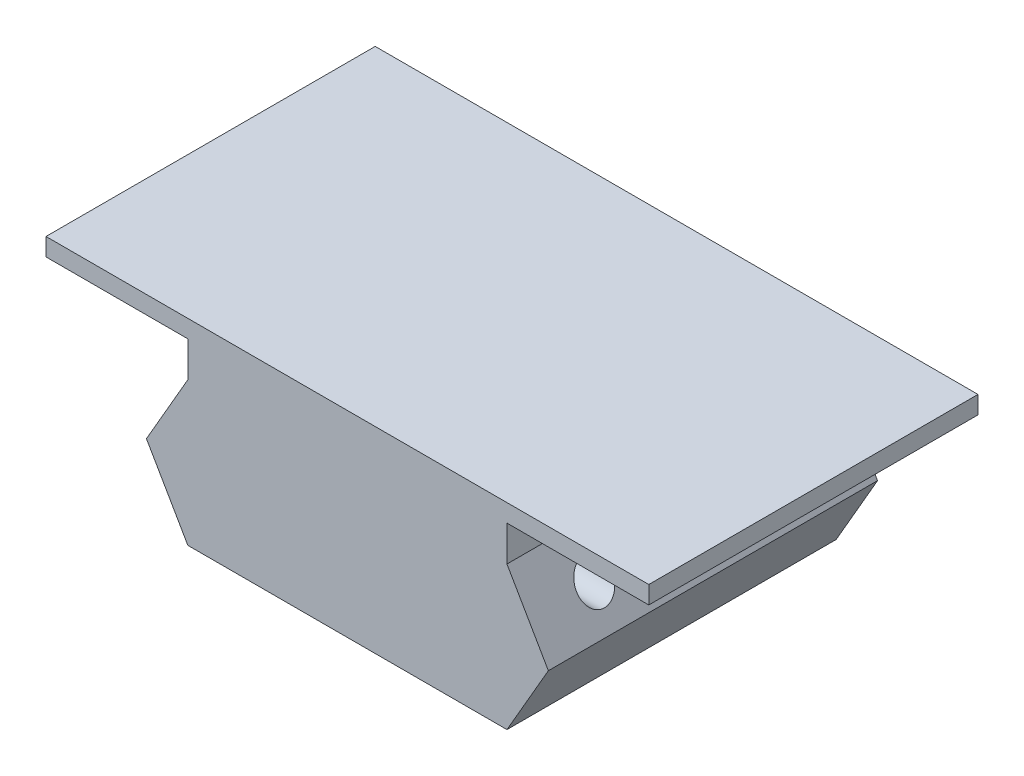
ISO-10303-21;
HEADER;
FILE_DESCRIPTION(('STEP AP214'),'2;1');
FILE_NAME('part.step','',(''),(''),'','','');
FILE_SCHEMA(('AUTOMOTIVE_DESIGN { 1 0 10303 214 1 1 1 1 }'));
ENDSEC;
DATA;
#1=APPLICATION_CONTEXT('core data for automotive mechanical design processes');
#2=APPLICATION_PROTOCOL_DEFINITION('international standard','automotive_design',2000,#1);
#3=PRODUCT_CONTEXT('',#1,'mechanical');
#4=PRODUCT('Part','Part','',(#3));
#5=PRODUCT_RELATED_PRODUCT_CATEGORY('part','',(#4));
#6=PRODUCT_DEFINITION_FORMATION('','',#4);
#7=PRODUCT_DEFINITION_CONTEXT('part definition',#1,'design');
#8=PRODUCT_DEFINITION('design','',#6,#7);
#9=PRODUCT_DEFINITION_SHAPE('','',#8);
#10=(LENGTH_UNIT() NAMED_UNIT(*) SI_UNIT(.MILLI.,.METRE.));
#11=(NAMED_UNIT(*) PLANE_ANGLE_UNIT() SI_UNIT($,.RADIAN.));
#12=(NAMED_UNIT(*) SI_UNIT($,.STERADIAN.) SOLID_ANGLE_UNIT());
#13=UNCERTAINTY_MEASURE_WITH_UNIT(LENGTH_MEASURE(1.E-05),#10,'distance_accuracy_value','');
#14=(GEOMETRIC_REPRESENTATION_CONTEXT(3) GLOBAL_UNCERTAINTY_ASSIGNED_CONTEXT((#13)) GLOBAL_UNIT_ASSIGNED_CONTEXT((#10,
#11,#12)) REPRESENTATION_CONTEXT('',''));
#15=CARTESIAN_POINT('',(0.,0.,0.));
#16=DIRECTION('',(0.,0.,1.));
#17=DIRECTION('',(1.,0.,0.));
#18=AXIS2_PLACEMENT_3D('',#15,#16,#17);
#19=CARTESIAN_POINT('',(-16.3069995829945,10.0886772713467,-18.568445));
#20=DIRECTION('',(1.,0.,0.));
#21=DIRECTION('',(0.,0.,-1.));
#22=AXIS2_PLACEMENT_3D('',#19,#20,#21);
#23=PLANE('',#22);
#24=DIRECTION('',(0.,1.,0.));
#25=VECTOR('',#24,1.);
#26=CARTESIAN_POINT('',(-16.3069995829945,10.0886772713467,0.));
#27=LINE('',#26,#25);
#28=CARTESIAN_POINT('',(-16.3069995829945,10.0886772713467,0.));
#29=VERTEX_POINT('',#28);
#30=CARTESIAN_POINT('',(-16.3069995829945,11.0886772713467,0.));
#31=VERTEX_POINT('',#30);
#32=EDGE_CURVE('E172',#29,#31,#27,.T.);
#33=ORIENTED_EDGE('',*,*,#32,.T.);
#34=DIRECTION('',(0.,0.,1.));
#35=VECTOR('',#34,1.);
#36=CARTESIAN_POINT('',(-16.3069995829945,11.0886772713467,-18.568445));
#37=LINE('',#36,#35);
#38=CARTESIAN_POINT('',(-16.3069995829945,11.0886772713467,-18.568445));
#39=VERTEX_POINT('',#38);
#40=EDGE_CURVE('E11',#39,#31,#37,.T.);
#41=ORIENTED_EDGE('',*,*,#40,.F.);
#42=DIRECTION('',(0.,1.,0.));
#43=VECTOR('',#42,1.);
#44=CARTESIAN_POINT('',(-16.3069995829945,10.0886772713467,-18.568445));
#45=LINE('',#44,#43);
#46=CARTESIAN_POINT('',(-16.3069995829945,10.0886772713467,-18.568445));
#47=VERTEX_POINT('',#46);
#48=EDGE_CURVE('E207',#47,#39,#45,.T.);
#49=ORIENTED_EDGE('',*,*,#48,.F.);
#50=DIRECTION('',(0.,0.,1.));
#51=VECTOR('',#50,1.);
#52=CARTESIAN_POINT('',(-16.3069995829945,10.0886772713467,-18.568445));
#53=LINE('',#52,#51);
#54=EDGE_CURVE('E168',#47,#29,#53,.T.);
#55=ORIENTED_EDGE('',*,*,#54,.T.);
#56=EDGE_LOOP('',(#33,#41,#49,#55));
#57=FACE_BOUND('',#56,.T.);
#58=ADVANCED_FACE('F45',(#57),#23,.F.);
#59=CARTESIAN_POINT('',(-16.3069995829945,11.0886772713467,-18.568445));
#60=DIRECTION('',(0.,-1.,0.));
#61=DIRECTION('',(0.,0.,-1.));
#62=AXIS2_PLACEMENT_3D('',#59,#60,#61);
#63=PLANE('',#62);
#64=DIRECTION('',(1.,0.,0.));
#65=VECTOR('',#64,1.);
#66=CARTESIAN_POINT('',(-16.3069995829945,11.0886772713467,0.));
#67=LINE('',#66,#65);
#68=CARTESIAN_POINT('',(17.6930004170055,11.0886772713467,0.));
#69=VERTEX_POINT('',#68);
#70=EDGE_CURVE('E176',#31,#69,#67,.T.);
#71=ORIENTED_EDGE('',*,*,#70,.T.);
#72=DIRECTION('',(0.,0.,1.));
#73=VECTOR('',#72,1.);
#74=CARTESIAN_POINT('',(17.6930004170055,11.0886772713467,-18.568445));
#75=LINE('',#74,#73);
#76=CARTESIAN_POINT('',(17.6930004170055,11.0886772713467,-18.568445));
#77=VERTEX_POINT('',#76);
#78=EDGE_CURVE('E55',#77,#69,#75,.T.);
#79=ORIENTED_EDGE('',*,*,#78,.F.);
#80=DIRECTION('',(1.,0.,0.));
#81=VECTOR('',#80,1.);
#82=CARTESIAN_POINT('',(-16.3069995829945,11.0886772713467,-18.568445));
#83=LINE('',#82,#81);
#84=EDGE_CURVE('E119',#39,#77,#83,.T.);
#85=ORIENTED_EDGE('',*,*,#84,.F.);
#86=ORIENTED_EDGE('',*,*,#40,.T.);
#87=EDGE_LOOP('',(#71,#79,#85,#86));
#88=FACE_BOUND('',#87,.T.);
#89=ADVANCED_FACE('F349',(#88),#63,.F.);
#90=CARTESIAN_POINT('',(17.6930004170055,11.0886772713467,-18.568445));
#91=DIRECTION('',(-1.,0.,0.));
#92=DIRECTION('',(0.,0.,1.));
#93=AXIS2_PLACEMENT_3D('',#90,#91,#92);
#94=PLANE('',#93);
#95=DIRECTION('',(0.,-1.,0.));
#96=VECTOR('',#95,1.);
#97=CARTESIAN_POINT('',(17.6930004170055,11.0886772713467,0.));
#98=LINE('',#97,#96);
#99=CARTESIAN_POINT('',(17.6930004170055,10.0886772713467,0.));
#100=VERTEX_POINT('',#99);
#101=EDGE_CURVE('E180',#69,#100,#98,.T.);
#102=ORIENTED_EDGE('',*,*,#101,.T.);
#103=DIRECTION('',(0.,0.,1.));
#104=VECTOR('',#103,1.);
#105=CARTESIAN_POINT('',(17.6930004170055,10.0886772713467,-18.568445));
#106=LINE('',#105,#104);
#107=CARTESIAN_POINT('',(17.6930004170055,10.0886772713467,-18.568445));
#108=VERTEX_POINT('',#107);
#109=EDGE_CURVE('E234',#108,#100,#106,.T.);
#110=ORIENTED_EDGE('',*,*,#109,.F.);
#111=DIRECTION('',(0.,-1.,0.));
#112=VECTOR('',#111,1.);
#113=CARTESIAN_POINT('',(17.6930004170055,11.0886772713467,-18.568445));
#114=LINE('',#113,#112);
#115=EDGE_CURVE('E273',#77,#108,#114,.T.);
#116=ORIENTED_EDGE('',*,*,#115,.F.);
#117=ORIENTED_EDGE('',*,*,#78,.T.);
#118=EDGE_LOOP('',(#102,#110,#116,#117));
#119=FACE_BOUND('',#118,.T.);
#120=ADVANCED_FACE('F353',(#119),#94,.F.);
#121=CARTESIAN_POINT('',(17.6930004170055,10.0886772713467,-18.568445));
#122=DIRECTION('',(0.,1.,0.));
#123=DIRECTION('',(0.,0.,1.));
#124=AXIS2_PLACEMENT_3D('',#121,#122,#123);
#125=PLANE('',#124);
#126=DIRECTION('',(-1.,0.,0.));
#127=VECTOR('',#126,1.);
#128=CARTESIAN_POINT('',(17.6930004170055,10.0886772713467,0.));
#129=LINE('',#128,#127);
#130=CARTESIAN_POINT('',(9.69300041700538,10.0886772713467,0.));
#131=VERTEX_POINT('',#130);
#132=EDGE_CURVE('E183',#100,#131,#129,.T.);
#133=ORIENTED_EDGE('',*,*,#132,.T.);
#134=DIRECTION('',(0.,0.,1.));
#135=VECTOR('',#134,1.);
#136=CARTESIAN_POINT('',(9.69300041700538,10.0886772713467,-18.568445));
#137=LINE('',#136,#135);
#138=CARTESIAN_POINT('',(9.69300041700538,10.0886772713467,-18.568445));
#139=VERTEX_POINT('',#138);
#140=EDGE_CURVE('E230',#139,#131,#137,.T.);
#141=ORIENTED_EDGE('',*,*,#140,.F.);
#142=DIRECTION('',(-1.,0.,0.));
#143=VECTOR('',#142,1.);
#144=CARTESIAN_POINT('',(17.6930004170055,10.0886772713467,-18.568445));
#145=LINE('',#144,#143);
#146=EDGE_CURVE('E276',#108,#139,#145,.T.);
#147=ORIENTED_EDGE('',*,*,#146,.F.);
#148=ORIENTED_EDGE('',*,*,#109,.T.);
#149=EDGE_LOOP('',(#133,#141,#147,#148));
#150=FACE_BOUND('',#149,.T.);
#151=ADVANCED_FACE('F357',(#150),#125,.F.);
#152=CARTESIAN_POINT('',(9.69300041700538,10.0886772713467,-18.568445));
#153=DIRECTION('',(-1.,0.,0.));
#154=DIRECTION('',(0.,-1.,0.));
#155=AXIS2_PLACEMENT_3D('',#152,#153,#154);
#156=PLANE('',#155);
#157=DIRECTION('',(0.,-1.,0.));
#158=VECTOR('',#157,1.);
#159=CARTESIAN_POINT('',(9.69300041700538,10.0886772713467,0.));
#160=LINE('',#159,#158);
#161=CARTESIAN_POINT('',(9.69300041700546,8.08867727134664,0.));
#162=VERTEX_POINT('',#161);
#163=EDGE_CURVE('E186',#131,#162,#160,.T.);
#164=ORIENTED_EDGE('',*,*,#163,.T.);
#165=DIRECTION('',(0.,0.,1.));
#166=VECTOR('',#165,1.);
#167=CARTESIAN_POINT('',(9.69300041700546,8.08867727134664,-18.568445));
#168=LINE('',#167,#166);
#169=CARTESIAN_POINT('',(9.69300041700546,8.08867727134664,-18.568445));
#170=VERTEX_POINT('',#169);
#171=EDGE_CURVE('E226',#170,#162,#168,.T.);
#172=ORIENTED_EDGE('',*,*,#171,.F.);
#173=DIRECTION('',(0.,-1.,0.));
#174=VECTOR('',#173,1.);
#175=CARTESIAN_POINT('',(9.69300041700538,10.0886772713467,-18.568445));
#176=LINE('',#175,#174);
#177=EDGE_CURVE('E279',#139,#170,#176,.T.);
#178=ORIENTED_EDGE('',*,*,#177,.F.);
#179=ORIENTED_EDGE('',*,*,#140,.T.);
#180=EDGE_LOOP('',(#164,#172,#178,#179));
#181=FACE_BOUND('',#180,.T.);
#182=ADVANCED_FACE('F307',(#181),#156,.F.);
#183=CARTESIAN_POINT('',(9.69300041700546,8.08867727134664,-18.568445));
#184=DIRECTION('',(-0.866025403784435,-0.500000000000006,0.));
#185=DIRECTION('',(0.500000000000006,-0.866025403784435,0.));
#186=AXIS2_PLACEMENT_3D('',#183,#184,#185);
#187=PLANE('',#186);
#188=CARTESIAN_POINT('',(10.9054359823037,5.98867727134664,-3.71));
#189=DIRECTION('',(-0.866025403784435,-0.500000000000006,0.));
#190=DIRECTION('',(0.500000000000006,-0.866025403784435,0.));
#191=AXIS2_PLACEMENT_3D('',#188,#189,#190);
#192=ELLIPSE('',#191,1.15470053837926,1.);
#193=CARTESIAN_POINT('',(11.4827862514933,4.98867727134664,-3.71));
#194=VERTEX_POINT('',#193);
#195=EDGE_CURVE('E177',#194,#194,#192,.T.);
#196=ORIENTED_EDGE('',*,*,#195,.T.);
#197=EDGE_LOOP('',(#196));
#198=FACE_BOUND('',#197,.T.);
#199=CARTESIAN_POINT('',(10.9054359823037,5.98867727134664,-7.42));
#200=DIRECTION('',(-0.866025403784435,-0.500000000000006,0.));
#201=DIRECTION('',(0.500000000000006,-0.866025403784435,0.));
#202=AXIS2_PLACEMENT_3D('',#199,#200,#201);
#203=ELLIPSE('',#202,1.15470053837926,1.);
#204=CARTESIAN_POINT('',(11.4827862514933,4.98867727134664,-7.42));
#205=VERTEX_POINT('',#204);
#206=EDGE_CURVE('E253',#205,#205,#203,.T.);
#207=ORIENTED_EDGE('',*,*,#206,.T.);
#208=EDGE_LOOP('',(#207));
#209=FACE_BOUND('',#208,.T.);
#210=CARTESIAN_POINT('',(10.9054359823037,5.98867727134664,-11.13));
#211=DIRECTION('',(-0.866025403784435,-0.500000000000006,0.));
#212=DIRECTION('',(0.500000000000006,-0.866025403784435,0.));
#213=AXIS2_PLACEMENT_3D('',#210,#211,#212);
#214=ELLIPSE('',#213,1.15470053837926,1.);
#215=CARTESIAN_POINT('',(11.4827862514933,4.98867727134664,-11.13));
#216=VERTEX_POINT('',#215);
#217=EDGE_CURVE('E249',#216,#216,#214,.T.);
#218=ORIENTED_EDGE('',*,*,#217,.T.);
#219=EDGE_LOOP('',(#218));
#220=FACE_BOUND('',#219,.T.);
#221=CARTESIAN_POINT('',(10.9054359823037,5.98867727134664,-14.84));
#222=DIRECTION('',(-0.866025403784435,-0.500000000000006,0.));
#223=DIRECTION('',(0.500000000000006,-0.866025403784435,0.));
#224=AXIS2_PLACEMENT_3D('',#221,#222,#223);
#225=ELLIPSE('',#224,1.15470053837926,1.);
#226=CARTESIAN_POINT('',(11.4827862514933,4.98867727134664,-14.84));
#227=VERTEX_POINT('',#226);
#228=EDGE_CURVE('E245',#227,#227,#225,.T.);
#229=ORIENTED_EDGE('',*,*,#228,.T.);
#230=EDGE_LOOP('',(#229));
#231=FACE_BOUND('',#230,.T.);
#232=DIRECTION('',(0.500000000000007,-0.866025403784435,0.));
#233=VECTOR('',#232,1.);
#234=CARTESIAN_POINT('',(9.69300041700546,8.08867727134664,0.));
#235=LINE('',#234,#233);
#236=CARTESIAN_POINT('',(12.0280004170055,4.04433863567331,0.));
#237=VERTEX_POINT('',#236);
#238=EDGE_CURVE('E189',#162,#237,#235,.T.);
#239=ORIENTED_EDGE('',*,*,#238,.T.);
#240=DIRECTION('',(0.,0.,1.));
#241=VECTOR('',#240,1.);
#242=CARTESIAN_POINT('',(12.0280004170055,4.04433863567331,-18.568445));
#243=LINE('',#242,#241);
#244=CARTESIAN_POINT('',(12.0280004170055,4.04433863567331,-18.568445));
#245=VERTEX_POINT('',#244);
#246=EDGE_CURVE('E222',#245,#237,#243,.T.);
#247=ORIENTED_EDGE('',*,*,#246,.F.);
#248=DIRECTION('',(0.500000000000007,-0.866025403784435,0.));
#249=VECTOR('',#248,1.);
#250=CARTESIAN_POINT('',(9.69300041700546,8.08867727134664,-18.568445));
#251=LINE('',#250,#249);
#252=EDGE_CURVE('E282',#170,#245,#251,.T.);
#253=ORIENTED_EDGE('',*,*,#252,.F.);
#254=ORIENTED_EDGE('',*,*,#171,.T.);
#255=EDGE_LOOP('',(#239,#247,#253,#254));
#256=FACE_BOUND('',#255,.T.);
#257=ADVANCED_FACE('F303',(#198,#209,#220,#231,#256),#187,.F.);
#258=CARTESIAN_POINT('',(12.0280004170055,4.04433863567331,-18.568445));
#259=DIRECTION('',(-0.866025403784441,0.499999999999997,0.));
#260=DIRECTION('',(-0.499999999999997,-0.866025403784441,0.));
#261=AXIS2_PLACEMENT_3D('',#258,#259,#260);
#262=PLANE('',#261);
#263=DIRECTION('',(-0.499999999999997,-0.866025403784441,0.));
#264=VECTOR('',#263,1.);
#265=CARTESIAN_POINT('',(12.0280004170055,4.04433863567331,0.));
#266=LINE('',#265,#264);
#267=CARTESIAN_POINT('',(9.69300041700553,0.,0.));
#268=VERTEX_POINT('',#267);
#269=EDGE_CURVE('E192',#237,#268,#266,.T.);
#270=ORIENTED_EDGE('',*,*,#269,.T.);
#271=DIRECTION('',(0.,0.,1.));
#272=VECTOR('',#271,1.);
#273=CARTESIAN_POINT('',(9.69300041700553,0.,-18.568445));
#274=LINE('',#273,#272);
#275=CARTESIAN_POINT('',(9.69300041700553,0.,-18.568445));
#276=VERTEX_POINT('',#275);
#277=EDGE_CURVE('E218',#276,#268,#274,.T.);
#278=ORIENTED_EDGE('',*,*,#277,.F.);
#279=DIRECTION('',(-0.499999999999997,-0.866025403784441,0.));
#280=VECTOR('',#279,1.);
#281=CARTESIAN_POINT('',(12.0280004170055,4.04433863567331,-18.568445));
#282=LINE('',#281,#280);
#283=EDGE_CURVE('E285',#245,#276,#282,.T.);
#284=ORIENTED_EDGE('',*,*,#283,.F.);
#285=ORIENTED_EDGE('',*,*,#246,.T.);
#286=EDGE_LOOP('',(#270,#278,#284,#285));
#287=FACE_BOUND('',#286,.T.);
#288=ADVANCED_FACE('F306',(#287),#262,.F.);
#289=CARTESIAN_POINT('',(9.69300041700553,0.,-18.568445));
#290=DIRECTION('',(0.,1.,0.));
#291=DIRECTION('',(-1.,0.,0.));
#292=AXIS2_PLACEMENT_3D('',#289,#290,#291);
#293=PLANE('',#292);
#294=DIRECTION('',(-1.,0.,0.));
#295=VECTOR('',#294,1.);
#296=CARTESIAN_POINT('',(9.69300041700553,0.,0.));
#297=LINE('',#296,#295);
#298=CARTESIAN_POINT('',(-8.30699958299447,0.,0.));
#299=VERTEX_POINT('',#298);
#300=EDGE_CURVE('E195',#268,#299,#297,.T.);
#301=ORIENTED_EDGE('',*,*,#300,.T.);
#302=DIRECTION('',(0.,0.,1.));
#303=VECTOR('',#302,1.);
#304=CARTESIAN_POINT('',(-8.30699958299447,0.,-18.568445));
#305=LINE('',#304,#303);
#306=CARTESIAN_POINT('',(-8.30699958299447,0.,-18.568445));
#307=VERTEX_POINT('',#306);
#308=EDGE_CURVE('E214',#307,#299,#305,.T.);
#309=ORIENTED_EDGE('',*,*,#308,.F.);
#310=DIRECTION('',(-1.,0.,0.));
#311=VECTOR('',#310,1.);
#312=CARTESIAN_POINT('',(9.69300041700553,0.,-18.568445));
#313=LINE('',#312,#311);
#314=EDGE_CURVE('E288',#276,#307,#313,.T.);
#315=ORIENTED_EDGE('',*,*,#314,.F.);
#316=ORIENTED_EDGE('',*,*,#277,.T.);
#317=EDGE_LOOP('',(#301,#309,#315,#316));
#318=FACE_BOUND('',#317,.T.);
#319=ADVANCED_FACE('F330',(#318),#293,.F.);
#320=CARTESIAN_POINT('',(-8.30699958299447,0.,-18.568445));
#321=DIRECTION('',(0.866025403784439,0.5,0.));
#322=DIRECTION('',(-0.5,0.866025403784439,0.));
#323=AXIS2_PLACEMENT_3D('',#320,#321,#322);
#324=PLANE('',#323);
#325=DIRECTION('',(-0.5,0.866025403784439,0.));
#326=VECTOR('',#325,1.);
#327=CARTESIAN_POINT('',(-8.30699958299447,0.,0.));
#328=LINE('',#327,#326);
#329=CARTESIAN_POINT('',(-10.6419995829945,4.04433863567338,0.));
#330=VERTEX_POINT('',#329);
#331=EDGE_CURVE('E198',#299,#330,#328,.T.);
#332=ORIENTED_EDGE('',*,*,#331,.T.);
#333=DIRECTION('',(0.,0.,1.));
#334=VECTOR('',#333,1.);
#335=CARTESIAN_POINT('',(-10.6419995829945,4.04433863567338,-18.568445));
#336=LINE('',#335,#334);
#337=CARTESIAN_POINT('',(-10.6419995829945,4.04433863567338,-18.568445));
#338=VERTEX_POINT('',#337);
#339=EDGE_CURVE('E161',#338,#330,#336,.T.);
#340=ORIENTED_EDGE('',*,*,#339,.F.);
#341=DIRECTION('',(-0.5,0.866025403784439,0.));
#342=VECTOR('',#341,1.);
#343=CARTESIAN_POINT('',(-8.30699958299447,0.,-18.568445));
#344=LINE('',#343,#342);
#345=EDGE_CURVE('E150',#307,#338,#344,.T.);
#346=ORIENTED_EDGE('',*,*,#345,.F.);
#347=ORIENTED_EDGE('',*,*,#308,.T.);
#348=EDGE_LOOP('',(#332,#340,#346,#347));
#349=FACE_BOUND('',#348,.T.);
#350=ADVANCED_FACE('F333',(#349),#324,.F.);
#351=CARTESIAN_POINT('',(-10.6419995829945,4.04433863567338,-18.568445));
#352=DIRECTION('',(0.866025403784436,-0.500000000000004,0.));
#353=DIRECTION('',(0.500000000000004,0.866025403784436,0.));
#354=AXIS2_PLACEMENT_3D('',#351,#352,#353);
#355=PLANE('',#354);
#356=CARTESIAN_POINT('',(-9.51943514829274,5.98867727134664,-3.71));
#357=DIRECTION('',(0.866025403784436,-0.500000000000004,0.));
#358=DIRECTION('',(0.500000000000004,0.866025403784436,0.));
#359=AXIS2_PLACEMENT_3D('',#356,#357,#358);
#360=ELLIPSE('',#359,1.15470053837925,1.);
#361=CARTESIAN_POINT('',(-8.94208487910311,6.98867727134664,-3.71));
#362=VERTEX_POINT('',#361);
#363=EDGE_CURVE('E48',#362,#362,#360,.T.);
#364=ORIENTED_EDGE('',*,*,#363,.T.);
#365=EDGE_LOOP('',(#364));
#366=FACE_BOUND('',#365,.T.);
#367=CARTESIAN_POINT('',(-9.51943514829274,5.98867727134664,-7.42));
#368=DIRECTION('',(0.866025403784436,-0.500000000000004,0.));
#369=DIRECTION('',(0.500000000000004,0.866025403784436,0.));
#370=AXIS2_PLACEMENT_3D('',#367,#368,#369);
#371=ELLIPSE('',#370,1.15470053837925,1.);
#372=CARTESIAN_POINT('',(-8.94208487910311,6.98867727134664,-7.42));
#373=VERTEX_POINT('',#372);
#374=EDGE_CURVE('E250',#373,#373,#371,.T.);
#375=ORIENTED_EDGE('',*,*,#374,.T.);
#376=EDGE_LOOP('',(#375));
#377=FACE_BOUND('',#376,.T.);
#378=CARTESIAN_POINT('',(-9.51943514829274,5.98867727134664,-11.13));
#379=DIRECTION('',(0.866025403784436,-0.500000000000004,0.));
#380=DIRECTION('',(0.500000000000004,0.866025403784436,0.));
#381=AXIS2_PLACEMENT_3D('',#378,#379,#380);
#382=ELLIPSE('',#381,1.15470053837926,1.);
#383=CARTESIAN_POINT('',(-8.94208487910311,6.98867727134664,-11.13));
#384=VERTEX_POINT('',#383);
#385=EDGE_CURVE('E246',#384,#384,#382,.T.);
#386=ORIENTED_EDGE('',*,*,#385,.T.);
#387=EDGE_LOOP('',(#386));
#388=FACE_BOUND('',#387,.T.);
#389=CARTESIAN_POINT('',(-9.51943514829274,5.98867727134664,-14.84));
#390=DIRECTION('',(0.866025403784436,-0.500000000000004,0.));
#391=DIRECTION('',(0.500000000000004,0.866025403784436,0.));
#392=AXIS2_PLACEMENT_3D('',#389,#390,#391);
#393=ELLIPSE('',#392,1.15470053837926,1.);
#394=CARTESIAN_POINT('',(-8.94208487910311,6.98867727134664,-14.84));
#395=VERTEX_POINT('',#394);
#396=EDGE_CURVE('E241',#395,#395,#393,.T.);
#397=ORIENTED_EDGE('',*,*,#396,.T.);
#398=EDGE_LOOP('',(#397));
#399=FACE_BOUND('',#398,.T.);
#400=DIRECTION('',(0.500000000000004,0.866025403784436,0.));
#401=VECTOR('',#400,1.);
#402=CARTESIAN_POINT('',(-10.6419995829945,4.04433863567338,0.));
#403=LINE('',#402,#401);
#404=CARTESIAN_POINT('',(-8.30699958299447,8.08867727134671,0.));
#405=VERTEX_POINT('',#404);
#406=EDGE_CURVE('E159',#330,#405,#403,.T.);
#407=ORIENTED_EDGE('',*,*,#406,.T.);
#408=DIRECTION('',(0.,0.,1.));
#409=VECTOR('',#408,1.);
#410=CARTESIAN_POINT('',(-8.30699958299447,8.08867727134671,-18.568445));
#411=LINE('',#410,#409);
#412=CARTESIAN_POINT('',(-8.30699958299447,8.08867727134671,-18.568445));
#413=VERTEX_POINT('',#412);
#414=EDGE_CURVE('E156',#413,#405,#411,.T.);
#415=ORIENTED_EDGE('',*,*,#414,.F.);
#416=DIRECTION('',(0.500000000000004,0.866025403784436,0.));
#417=VECTOR('',#416,1.);
#418=CARTESIAN_POINT('',(-10.6419995829945,4.04433863567338,-18.568445));
#419=LINE('',#418,#417);
#420=EDGE_CURVE('E144',#338,#413,#419,.T.);
#421=ORIENTED_EDGE('',*,*,#420,.F.);
#422=ORIENTED_EDGE('',*,*,#339,.T.);
#423=EDGE_LOOP('',(#407,#415,#421,#422));
#424=FACE_BOUND('',#423,.T.);
#425=ADVANCED_FACE('F157',(#366,#377,#388,#399,#424),#355,.F.);
#426=CARTESIAN_POINT('',(-8.30699958299447,8.08867727134671,-18.568445));
#427=DIRECTION('',(1.,0.,0.));
#428=DIRECTION('',(0.,0.,-1.));
#429=AXIS2_PLACEMENT_3D('',#426,#427,#428);
#430=PLANE('',#429);
#431=DIRECTION('',(0.,1.,0.));
#432=VECTOR('',#431,1.);
#433=CARTESIAN_POINT('',(-8.30699958299447,8.08867727134671,0.));
#434=LINE('',#433,#432);
#435=CARTESIAN_POINT('',(-8.30699958299447,10.0886772713467,0.));
#436=VERTEX_POINT('',#435);
#437=EDGE_CURVE('E105',#405,#436,#434,.T.);
#438=ORIENTED_EDGE('',*,*,#437,.T.);
#439=DIRECTION('',(0.,0.,1.));
#440=VECTOR('',#439,1.);
#441=CARTESIAN_POINT('',(-8.30699958299447,10.0886772713467,-18.568445));
#442=LINE('',#441,#440);
#443=CARTESIAN_POINT('',(-8.30699958299447,10.0886772713467,-18.568445));
#444=VERTEX_POINT('',#443);
#445=EDGE_CURVE('E162',#444,#436,#442,.T.);
#446=ORIENTED_EDGE('',*,*,#445,.F.);
#447=DIRECTION('',(0.,1.,0.));
#448=VECTOR('',#447,1.);
#449=CARTESIAN_POINT('',(-8.30699958299447,8.08867727134671,-18.568445));
#450=LINE('',#449,#448);
#451=EDGE_CURVE('E148',#413,#444,#450,.T.);
#452=ORIENTED_EDGE('',*,*,#451,.F.);
#453=ORIENTED_EDGE('',*,*,#414,.T.);
#454=EDGE_LOOP('',(#438,#446,#452,#453));
#455=FACE_BOUND('',#454,.T.);
#456=ADVANCED_FACE('F164',(#455),#430,.F.);
#457=CARTESIAN_POINT('',(-8.30699958299447,10.0886772713467,-18.568445));
#458=DIRECTION('',(0.,1.,0.));
#459=DIRECTION('',(-1.,0.,0.));
#460=AXIS2_PLACEMENT_3D('',#457,#458,#459);
#461=PLANE('',#460);
#462=DIRECTION('',(-1.,0.,0.));
#463=VECTOR('',#462,1.);
#464=CARTESIAN_POINT('',(-8.30699958299447,10.0886772713467,0.));
#465=LINE('',#464,#463);
#466=EDGE_CURVE('E111',#436,#29,#465,.T.);
#467=ORIENTED_EDGE('',*,*,#466,.T.);
#468=ORIENTED_EDGE('',*,*,#54,.F.);
#469=DIRECTION('',(-1.,0.,0.));
#470=VECTOR('',#469,1.);
#471=CARTESIAN_POINT('',(-8.30699958299447,10.0886772713467,-18.568445));
#472=LINE('',#471,#470);
#473=EDGE_CURVE('E64',#444,#47,#472,.T.);
#474=ORIENTED_EDGE('',*,*,#473,.F.);
#475=ORIENTED_EDGE('',*,*,#445,.T.);
#476=EDGE_LOOP('',(#467,#468,#474,#475));
#477=FACE_BOUND('',#476,.T.);
#478=ADVANCED_FACE('F338',(#477),#461,.F.);
#479=CARTESIAN_POINT('',(0.,0.,-18.568445));
#480=DIRECTION('',(0.,0.,-1.));
#481=DIRECTION('',(-1.,0.,0.));
#482=AXIS2_PLACEMENT_3D('',#479,#480,#481);
#483=PLANE('',#482);
#484=ORIENTED_EDGE('',*,*,#48,.T.);
#485=ORIENTED_EDGE('',*,*,#84,.T.);
#486=ORIENTED_EDGE('',*,*,#115,.T.);
#487=ORIENTED_EDGE('',*,*,#146,.T.);
#488=ORIENTED_EDGE('',*,*,#177,.T.);
#489=ORIENTED_EDGE('',*,*,#252,.T.);
#490=ORIENTED_EDGE('',*,*,#283,.T.);
#491=ORIENTED_EDGE('',*,*,#314,.T.);
#492=ORIENTED_EDGE('',*,*,#345,.T.);
#493=ORIENTED_EDGE('',*,*,#420,.T.);
#494=ORIENTED_EDGE('',*,*,#451,.T.);
#495=ORIENTED_EDGE('',*,*,#473,.T.);
#496=EDGE_LOOP('',(#484,#485,#486,#487,#488,#489,#490,#491,#492,#493,#494,#495));
#497=FACE_BOUND('',#496,.T.);
#498=ADVANCED_FACE('F146',(#497),#483,.T.);
#499=CARTESIAN_POINT('',(0.,0.,0.));
#500=DIRECTION('',(0.,0.,-1.));
#501=DIRECTION('',(-1.,0.,0.));
#502=AXIS2_PLACEMENT_3D('',#499,#500,#501);
#503=PLANE('',#502);
#504=ORIENTED_EDGE('',*,*,#32,.F.);
#505=ORIENTED_EDGE('',*,*,#466,.F.);
#506=ORIENTED_EDGE('',*,*,#437,.F.);
#507=ORIENTED_EDGE('',*,*,#406,.F.);
#508=ORIENTED_EDGE('',*,*,#331,.F.);
#509=ORIENTED_EDGE('',*,*,#300,.F.);
#510=ORIENTED_EDGE('',*,*,#269,.F.);
#511=ORIENTED_EDGE('',*,*,#238,.F.);
#512=ORIENTED_EDGE('',*,*,#163,.F.);
#513=ORIENTED_EDGE('',*,*,#132,.F.);
#514=ORIENTED_EDGE('',*,*,#101,.F.);
#515=ORIENTED_EDGE('',*,*,#70,.F.);
#516=EDGE_LOOP('',(#504,#505,#506,#507,#508,#509,#510,#511,#512,#513,#514,#515));
#517=FACE_BOUND('',#516,.T.);
#518=ADVANCED_FACE('F326',(#517),#503,.F.);
#519=CARTESIAN_POINT('',(-16.3069995829945,5.98867727134664,-14.84));
#520=DIRECTION('',(1.,0.,0.));
#521=DIRECTION('',(0.,0.,-1.));
#522=AXIS2_PLACEMENT_3D('',#519,#520,#521);
#523=CYLINDRICAL_SURFACE('',#522,1.);
#524=ORIENTED_EDGE('',*,*,#396,.F.);
#525=EDGE_LOOP('',(#524));
#526=FACE_BOUND('',#525,.T.);
#527=ORIENTED_EDGE('',*,*,#228,.F.);
#528=EDGE_LOOP('',(#527));
#529=FACE_BOUND('',#528,.T.);
#530=ADVANCED_FACE('F385',(#526,#529),#523,.F.);
#531=CARTESIAN_POINT('',(-16.3069995829945,5.98867727134664,-11.13));
#532=DIRECTION('',(1.,0.,0.));
#533=DIRECTION('',(0.,0.,-1.));
#534=AXIS2_PLACEMENT_3D('',#531,#532,#533);
#535=CYLINDRICAL_SURFACE('',#534,1.);
#536=ORIENTED_EDGE('',*,*,#385,.F.);
#537=EDGE_LOOP('',(#536));
#538=FACE_BOUND('',#537,.T.);
#539=ORIENTED_EDGE('',*,*,#217,.F.);
#540=EDGE_LOOP('',(#539));
#541=FACE_BOUND('',#540,.T.);
#542=ADVANCED_FACE('F389',(#538,#541),#535,.F.);
#543=CARTESIAN_POINT('',(-16.3069995829945,5.98867727134664,-7.42));
#544=DIRECTION('',(1.,0.,0.));
#545=DIRECTION('',(0.,0.,-1.));
#546=AXIS2_PLACEMENT_3D('',#543,#544,#545);
#547=CYLINDRICAL_SURFACE('',#546,1.);
#548=ORIENTED_EDGE('',*,*,#374,.F.);
#549=EDGE_LOOP('',(#548));
#550=FACE_BOUND('',#549,.T.);
#551=ORIENTED_EDGE('',*,*,#206,.F.);
#552=EDGE_LOOP('',(#551));
#553=FACE_BOUND('',#552,.T.);
#554=ADVANCED_FACE('F299',(#550,#553),#547,.F.);
#555=CARTESIAN_POINT('',(-16.3069995829945,5.98867727134664,-3.71));
#556=DIRECTION('',(1.,0.,0.));
#557=DIRECTION('',(0.,0.,-1.));
#558=AXIS2_PLACEMENT_3D('',#555,#556,#557);
#559=CYLINDRICAL_SURFACE('',#558,1.);
#560=ORIENTED_EDGE('',*,*,#363,.F.);
#561=EDGE_LOOP('',(#560));
#562=FACE_BOUND('',#561,.T.);
#563=ORIENTED_EDGE('',*,*,#195,.F.);
#564=EDGE_LOOP('',(#563));
#565=FACE_BOUND('',#564,.T.);
#566=ADVANCED_FACE('F296',(#562,#565),#559,.F.);
#567=CLOSED_SHELL('',(#58,#89,#120,#151,#182,#257,#288,#319,#350,#425,#456,#478,#498,#518,#530,
#542,#554,#566));
#568=MANIFOLD_SOLID_BREP('B2',#567);
#569=ADVANCED_BREP_SHAPE_REPRESENTATION('',(#18,#568),#14);
#570=SHAPE_DEFINITION_REPRESENTATION(#9,#569);
ENDSEC;
END-ISO-10303-21;
